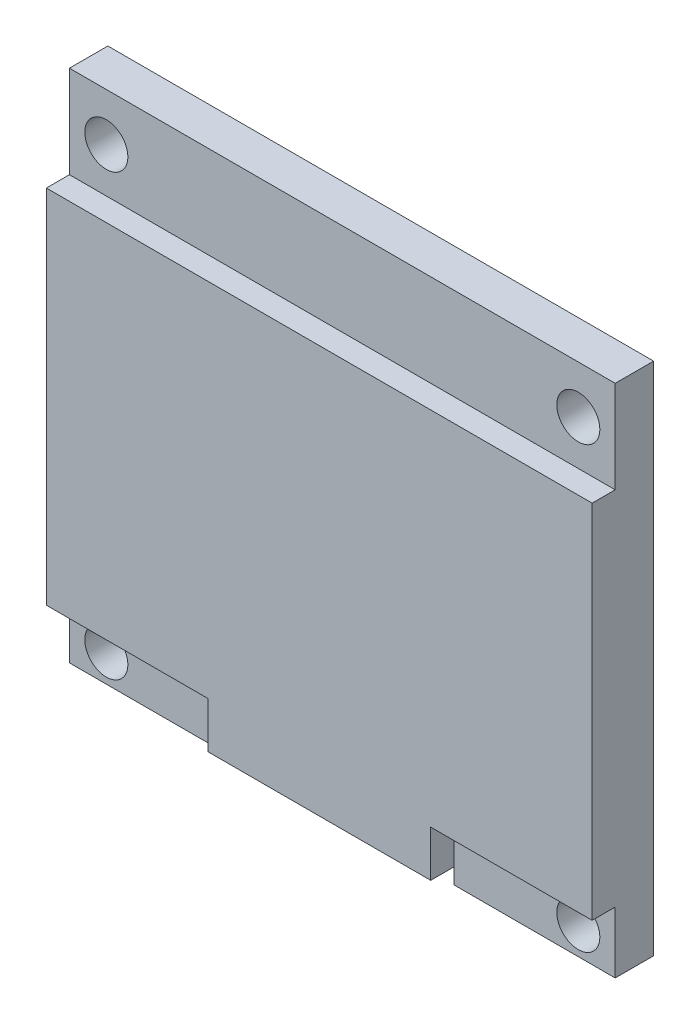
ISO-10303-21;
HEADER;
FILE_DESCRIPTION(('STEP AP214'),'2;1');
FILE_NAME('part.step','',(''),(''),'','','');
FILE_SCHEMA(('AUTOMOTIVE_DESIGN { 1 0 10303 214 1 1 1 1 }'));
ENDSEC;
DATA;
#1=APPLICATION_CONTEXT('core data for automotive mechanical design processes');
#2=APPLICATION_PROTOCOL_DEFINITION('international standard','automotive_design',2000,#1);
#3=PRODUCT_CONTEXT('',#1,'mechanical');
#4=PRODUCT('Part','Part','',(#3));
#5=PRODUCT_RELATED_PRODUCT_CATEGORY('part','',(#4));
#6=PRODUCT_DEFINITION_FORMATION('','',#4);
#7=PRODUCT_DEFINITION_CONTEXT('part definition',#1,'design');
#8=PRODUCT_DEFINITION('design','',#6,#7);
#9=PRODUCT_DEFINITION_SHAPE('','',#8);
#10=(LENGTH_UNIT() NAMED_UNIT(*) SI_UNIT(.MILLI.,.METRE.));
#11=(NAMED_UNIT(*) PLANE_ANGLE_UNIT() SI_UNIT($,.RADIAN.));
#12=(NAMED_UNIT(*) SI_UNIT($,.STERADIAN.) SOLID_ANGLE_UNIT());
#13=UNCERTAINTY_MEASURE_WITH_UNIT(LENGTH_MEASURE(1.E-05),#10,'distance_accuracy_value','');
#14=(GEOMETRIC_REPRESENTATION_CONTEXT(3) GLOBAL_UNCERTAINTY_ASSIGNED_CONTEXT((#13)) GLOBAL_UNIT_ASSIGNED_CONTEXT((#10,
#11,#12)) REPRESENTATION_CONTEXT('',''));
#15=CARTESIAN_POINT('',(0.,0.,0.));
#16=DIRECTION('',(0.,0.,1.));
#17=DIRECTION('',(1.,0.,0.));
#18=AXIS2_PLACEMENT_3D('',#15,#16,#17);
#19=CARTESIAN_POINT('',(-17.75,-16.75,2.5));
#20=DIRECTION('',(0.,1.,0.));
#21=DIRECTION('',(0.,0.,1.));
#22=AXIS2_PLACEMENT_3D('',#19,#20,#21);
#23=PLANE('',#22);
#24=DIRECTION('',(1.,0.,0.));
#25=VECTOR('',#24,1.);
#26=CARTESIAN_POINT('',(-17.75,-16.75,2.5));
#27=LINE('',#26,#25);
#28=CARTESIAN_POINT('',(7.25,-16.75,2.5));
#29=VERTEX_POINT('',#28);
#30=CARTESIAN_POINT('',(17.75,-16.75,2.5));
#31=VERTEX_POINT('',#30);
#32=EDGE_CURVE('E272',#29,#31,#27,.T.);
#33=ORIENTED_EDGE('',*,*,#32,.F.);
#34=DIRECTION('',(0.,0.,1.));
#35=VECTOR('',#34,1.);
#36=CARTESIAN_POINT('',(7.25,-16.75,0.));
#37=LINE('',#36,#35);
#38=CARTESIAN_POINT('',(7.25,-16.75,0.));
#39=VERTEX_POINT('',#38);
#40=EDGE_CURVE('E183',#39,#29,#37,.T.);
#41=ORIENTED_EDGE('',*,*,#40,.F.);
#42=DIRECTION('',(1.,0.,0.));
#43=VECTOR('',#42,1.);
#44=CARTESIAN_POINT('',(-17.75,-16.75,0.));
#45=LINE('',#44,#43);
#46=CARTESIAN_POINT('',(17.75,-16.75,0.));
#47=VERTEX_POINT('',#46);
#48=EDGE_CURVE('E168',#39,#47,#45,.T.);
#49=ORIENTED_EDGE('',*,*,#48,.T.);
#50=DIRECTION('',(0.,0.,-1.));
#51=VECTOR('',#50,1.);
#52=CARTESIAN_POINT('',(17.75,-16.75,2.5));
#53=LINE('',#52,#51);
#54=EDGE_CURVE('E277',#31,#47,#53,.T.);
#55=ORIENTED_EDGE('',*,*,#54,.F.);
#56=EDGE_LOOP('',(#33,#41,#49,#55));
#57=FACE_BOUND('',#56,.T.);
#58=ADVANCED_FACE('F38',(#57),#23,.F.);
#59=CARTESIAN_POINT('',(0.,0.,2.5));
#60=DIRECTION('',(0.,0.,1.));
#61=DIRECTION('',(1.,0.,0.));
#62=AXIS2_PLACEMENT_3D('',#59,#60,#61);
#63=PLANE('',#62);
#64=CARTESIAN_POINT('',(15.35,-14.95,2.5));
#65=DIRECTION('',(0.,0.,1.));
#66=DIRECTION('',(1.,0.,0.));
#67=AXIS2_PLACEMENT_3D('',#64,#65,#66);
#68=CIRCLE('',#67,1.4);
#69=CARTESIAN_POINT('',(16.75,-14.95,2.5));
#70=VERTEX_POINT('',#69);
#71=EDGE_CURVE('E422',#70,#70,#68,.T.);
#72=ORIENTED_EDGE('',*,*,#71,.F.);
#73=EDGE_LOOP('',(#72));
#74=FACE_BOUND('',#73,.T.);
#75=DIRECTION('',(0.,1.,0.));
#76=VECTOR('',#75,1.);
#77=CARTESIAN_POINT('',(7.25,-15.75,2.5));
#78=LINE('',#77,#76);
#79=CARTESIAN_POINT('',(7.25,-15.75,2.5));
#80=VERTEX_POINT('',#79);
#81=EDGE_CURVE('E62',#29,#80,#78,.T.);
#82=ORIENTED_EDGE('',*,*,#81,.F.);
#83=ORIENTED_EDGE('',*,*,#32,.T.);
#84=DIRECTION('',(0.,1.,0.));
#85=VECTOR('',#84,1.);
#86=CARTESIAN_POINT('',(17.75,16.75,2.5));
#87=LINE('',#86,#85);
#88=CARTESIAN_POINT('',(17.75,-12.75,2.5));
#89=VERTEX_POINT('',#88);
#90=EDGE_CURVE('E261',#31,#89,#87,.T.);
#91=ORIENTED_EDGE('',*,*,#90,.T.);
#92=DIRECTION('',(1.,0.,0.));
#93=VECTOR('',#92,1.);
#94=CARTESIAN_POINT('',(0.,-12.75,2.5));
#95=LINE('',#94,#93);
#96=CARTESIAN_POINT('',(7.25,-12.75,2.5));
#97=VERTEX_POINT('',#96);
#98=EDGE_CURVE('E54',#97,#89,#95,.T.);
#99=ORIENTED_EDGE('',*,*,#98,.F.);
#100=DIRECTION('',(0.,-1.,0.));
#101=VECTOR('',#100,1.);
#102=CARTESIAN_POINT('',(7.25,0.,2.5));
#103=LINE('',#102,#101);
#104=EDGE_CURVE('E228',#97,#80,#103,.T.);
#105=ORIENTED_EDGE('',*,*,#104,.T.);
#106=EDGE_LOOP('',(#82,#83,#91,#99,#105));
#107=FACE_BOUND('',#106,.T.);
#108=ADVANCED_FACE('F349',(#74,#107),#63,.T.);
#109=CARTESIAN_POINT('',(15.35,13.65,2.5));
#110=DIRECTION('',(0.,0.,1.));
#111=DIRECTION('',(1.,0.,0.));
#112=AXIS2_PLACEMENT_3D('',#109,#110,#111);
#113=CIRCLE('',#112,1.4);
#114=CARTESIAN_POINT('',(16.75,13.65,2.5));
#115=VERTEX_POINT('',#114);
#116=EDGE_CURVE('E413',#115,#115,#113,.T.);
#117=ORIENTED_EDGE('',*,*,#116,.F.);
#118=EDGE_LOOP('',(#117));
#119=FACE_BOUND('',#118,.T.);
#120=CARTESIAN_POINT('',(-15.35,13.65,2.5));
#121=DIRECTION('',(0.,0.,1.));
#122=DIRECTION('',(-1.,0.,0.));
#123=AXIS2_PLACEMENT_3D('',#120,#121,#122);
#124=CIRCLE('',#123,1.4);
#125=CARTESIAN_POINT('',(-16.75,13.65,2.5));
#126=VERTEX_POINT('',#125);
#127=EDGE_CURVE('E175',#126,#126,#124,.T.);
#128=ORIENTED_EDGE('',*,*,#127,.F.);
#129=EDGE_LOOP('',(#128));
#130=FACE_BOUND('',#129,.T.);
#131=DIRECTION('',(0.,-1.,0.));
#132=VECTOR('',#131,1.);
#133=CARTESIAN_POINT('',(-17.75,16.75,2.5));
#134=LINE('',#133,#132);
#135=CARTESIAN_POINT('',(-17.75,16.75,2.5));
#136=VERTEX_POINT('',#135);
#137=CARTESIAN_POINT('',(-17.75,10.75,2.5));
#138=VERTEX_POINT('',#137);
#139=EDGE_CURVE('E269',#136,#138,#134,.T.);
#140=ORIENTED_EDGE('',*,*,#139,.T.);
#141=DIRECTION('',(1.,0.,0.));
#142=VECTOR('',#141,1.);
#143=CARTESIAN_POINT('',(0.,10.75,2.5));
#144=LINE('',#143,#142);
#145=CARTESIAN_POINT('',(17.75,10.75,2.5));
#146=VERTEX_POINT('',#145);
#147=EDGE_CURVE('E186',#138,#146,#144,.T.);
#148=ORIENTED_EDGE('',*,*,#147,.T.);
#149=CARTESIAN_POINT('',(17.75,16.75,2.5));
#150=VERTEX_POINT('',#149);
#151=EDGE_CURVE('E265',#146,#150,#87,.T.);
#152=ORIENTED_EDGE('',*,*,#151,.T.);
#153=DIRECTION('',(-1.,0.,0.));
#154=VECTOR('',#153,1.);
#155=CARTESIAN_POINT('',(-17.75,16.75,2.5));
#156=LINE('',#155,#154);
#157=EDGE_CURVE('E264',#150,#136,#156,.T.);
#158=ORIENTED_EDGE('',*,*,#157,.T.);
#159=EDGE_LOOP('',(#140,#148,#152,#158));
#160=FACE_BOUND('',#159,.T.);
#161=ADVANCED_FACE('F331',(#119,#130,#160),#63,.T.);
#162=CARTESIAN_POINT('',(17.75,16.75,2.5));
#163=DIRECTION('',(-1.,0.,0.));
#164=DIRECTION('',(0.,-1.,0.));
#165=AXIS2_PLACEMENT_3D('',#162,#163,#164);
#166=PLANE('',#165);
#167=DIRECTION('',(0.,1.,0.));
#168=VECTOR('',#167,1.);
#169=CARTESIAN_POINT('',(17.75,16.75,0.));
#170=LINE('',#169,#168);
#171=CARTESIAN_POINT('',(17.75,16.75,0.));
#172=VERTEX_POINT('',#171);
#173=EDGE_CURVE('E260',#47,#172,#170,.T.);
#174=ORIENTED_EDGE('',*,*,#173,.T.);
#175=DIRECTION('',(0.,0.,-1.));
#176=VECTOR('',#175,1.);
#177=CARTESIAN_POINT('',(17.75,16.75,2.5));
#178=LINE('',#177,#176);
#179=EDGE_CURVE('E11',#150,#172,#178,.T.);
#180=ORIENTED_EDGE('',*,*,#179,.F.);
#181=ORIENTED_EDGE('',*,*,#151,.F.);
#182=DIRECTION('',(0.,0.,-1.));
#183=VECTOR('',#182,1.);
#184=CARTESIAN_POINT('',(17.75,10.75,4.));
#185=LINE('',#184,#183);
#186=CARTESIAN_POINT('',(17.75,10.75,4.));
#187=VERTEX_POINT('',#186);
#188=EDGE_CURVE('E217',#187,#146,#185,.T.);
#189=ORIENTED_EDGE('',*,*,#188,.F.);
#190=DIRECTION('',(0.,1.,0.));
#191=VECTOR('',#190,1.);
#192=CARTESIAN_POINT('',(17.75,0.,4.));
#193=LINE('',#192,#191);
#194=CARTESIAN_POINT('',(17.75,-12.75,4.));
#195=VERTEX_POINT('',#194);
#196=EDGE_CURVE('E214',#195,#187,#193,.T.);
#197=ORIENTED_EDGE('',*,*,#196,.F.);
#198=DIRECTION('',(0.,0.,-1.));
#199=VECTOR('',#198,1.);
#200=CARTESIAN_POINT('',(17.75,-12.75,4.));
#201=LINE('',#200,#199);
#202=EDGE_CURVE('E234',#195,#89,#201,.T.);
#203=ORIENTED_EDGE('',*,*,#202,.T.);
#204=ORIENTED_EDGE('',*,*,#90,.F.);
#205=ORIENTED_EDGE('',*,*,#54,.T.);
#206=EDGE_LOOP('',(#174,#180,#181,#189,#197,#203,#204,#205));
#207=FACE_BOUND('',#206,.T.);
#208=ADVANCED_FACE('F40',(#207),#166,.F.);
#209=CARTESIAN_POINT('',(-17.75,16.75,2.5));
#210=DIRECTION('',(0.,-1.,0.));
#211=DIRECTION('',(0.,0.,-1.));
#212=AXIS2_PLACEMENT_3D('',#209,#210,#211);
#213=PLANE('',#212);
#214=DIRECTION('',(-1.,0.,0.));
#215=VECTOR('',#214,1.);
#216=CARTESIAN_POINT('',(-17.75,16.75,0.));
#217=LINE('',#216,#215);
#218=CARTESIAN_POINT('',(-17.75,16.75,0.));
#219=VERTEX_POINT('',#218);
#220=EDGE_CURVE('E281',#172,#219,#217,.T.);
#221=ORIENTED_EDGE('',*,*,#220,.T.);
#222=DIRECTION('',(0.,0.,-1.));
#223=VECTOR('',#222,1.);
#224=CARTESIAN_POINT('',(-17.75,16.75,2.5));
#225=LINE('',#224,#223);
#226=EDGE_CURVE('E47',#136,#219,#225,.T.);
#227=ORIENTED_EDGE('',*,*,#226,.F.);
#228=ORIENTED_EDGE('',*,*,#157,.F.);
#229=ORIENTED_EDGE('',*,*,#179,.T.);
#230=EDGE_LOOP('',(#221,#227,#228,#229));
#231=FACE_BOUND('',#230,.T.);
#232=ADVANCED_FACE('F372',(#231),#213,.F.);
#233=CARTESIAN_POINT('',(-17.75,16.75,2.5));
#234=DIRECTION('',(1.,0.,0.));
#235=DIRECTION('',(0.,1.,0.));
#236=AXIS2_PLACEMENT_3D('',#233,#234,#235);
#237=PLANE('',#236);
#238=DIRECTION('',(0.,-1.,0.));
#239=VECTOR('',#238,1.);
#240=CARTESIAN_POINT('',(-17.75,16.75,0.));
#241=LINE('',#240,#239);
#242=CARTESIAN_POINT('',(-17.75,-16.75,0.));
#243=VERTEX_POINT('',#242);
#244=EDGE_CURVE('E284',#219,#243,#241,.T.);
#245=ORIENTED_EDGE('',*,*,#244,.T.);
#246=DIRECTION('',(0.,0.,-1.));
#247=VECTOR('',#246,1.);
#248=CARTESIAN_POINT('',(-17.75,-16.75,2.5));
#249=LINE('',#248,#247);
#250=CARTESIAN_POINT('',(-17.75,-16.75,2.5));
#251=VERTEX_POINT('',#250);
#252=EDGE_CURVE('E294',#251,#243,#249,.T.);
#253=ORIENTED_EDGE('',*,*,#252,.F.);
#254=CARTESIAN_POINT('',(-17.75,-12.75,2.5));
#255=VERTEX_POINT('',#254);
#256=EDGE_CURVE('E268',#255,#251,#134,.T.);
#257=ORIENTED_EDGE('',*,*,#256,.F.);
#258=DIRECTION('',(0.,0.,-1.));
#259=VECTOR('',#258,1.);
#260=CARTESIAN_POINT('',(-17.75,-12.75,4.));
#261=LINE('',#260,#259);
#262=CARTESIAN_POINT('',(-17.75,-12.75,4.));
#263=VERTEX_POINT('',#262);
#264=EDGE_CURVE('E252',#263,#255,#261,.T.);
#265=ORIENTED_EDGE('',*,*,#264,.F.);
#266=DIRECTION('',(0.,-1.,0.));
#267=VECTOR('',#266,1.);
#268=CARTESIAN_POINT('',(-17.75,0.,4.));
#269=LINE('',#268,#267);
#270=CARTESIAN_POINT('',(-17.75,10.75,4.));
#271=VERTEX_POINT('',#270);
#272=EDGE_CURVE('E197',#271,#263,#269,.T.);
#273=ORIENTED_EDGE('',*,*,#272,.F.);
#274=DIRECTION('',(0.,0.,-1.));
#275=VECTOR('',#274,1.);
#276=CARTESIAN_POINT('',(-17.75,10.75,4.));
#277=LINE('',#276,#275);
#278=EDGE_CURVE('E256',#271,#138,#277,.T.);
#279=ORIENTED_EDGE('',*,*,#278,.T.);
#280=ORIENTED_EDGE('',*,*,#139,.F.);
#281=ORIENTED_EDGE('',*,*,#226,.T.);
#282=EDGE_LOOP('',(#245,#253,#257,#265,#273,#279,#280,#281));
#283=FACE_BOUND('',#282,.T.);
#284=ADVANCED_FACE('F303',(#283),#237,.F.);
#285=CARTESIAN_POINT('',(-7.25000000000001,-16.75,0.));
#286=VERTEX_POINT('',#285);
#287=EDGE_CURVE('E287',#243,#286,#45,.T.);
#288=ORIENTED_EDGE('',*,*,#287,.T.);
#289=DIRECTION('',(0.,0.,1.));
#290=VECTOR('',#289,1.);
#291=CARTESIAN_POINT('',(-7.25000000000001,-16.75,0.));
#292=LINE('',#291,#290);
#293=CARTESIAN_POINT('',(-7.25000000000001,-16.75,2.5));
#294=VERTEX_POINT('',#293);
#295=EDGE_CURVE('E187',#286,#294,#292,.T.);
#296=ORIENTED_EDGE('',*,*,#295,.T.);
#297=EDGE_CURVE('E273',#251,#294,#27,.T.);
#298=ORIENTED_EDGE('',*,*,#297,.F.);
#299=ORIENTED_EDGE('',*,*,#252,.T.);
#300=EDGE_LOOP('',(#288,#296,#298,#299));
#301=FACE_BOUND('',#300,.T.);
#302=ADVANCED_FACE('F309',(#301),#23,.F.);
#303=CARTESIAN_POINT('',(-15.35,-14.95,2.5));
#304=DIRECTION('',(0.,0.,-1.));
#305=DIRECTION('',(-1.,0.,0.));
#306=AXIS2_PLACEMENT_3D('',#303,#304,#305);
#307=CIRCLE('',#306,1.4);
#308=CARTESIAN_POINT('',(-16.75,-14.95,2.5));
#309=VERTEX_POINT('',#308);
#310=EDGE_CURVE('E428',#309,#309,#307,.T.);
#311=ORIENTED_EDGE('',*,*,#310,.T.);
#312=EDGE_LOOP('',(#311));
#313=FACE_BOUND('',#312,.T.);
#314=DIRECTION('',(0.,-1.,0.));
#315=VECTOR('',#314,1.);
#316=CARTESIAN_POINT('',(-7.25000000000001,-15.75,2.5));
#317=LINE('',#316,#315);
#318=CARTESIAN_POINT('',(-7.25000000000001,-15.75,2.5));
#319=VERTEX_POINT('',#318);
#320=EDGE_CURVE('E170',#319,#294,#317,.T.);
#321=ORIENTED_EDGE('',*,*,#320,.F.);
#322=DIRECTION('',(0.,-1.,0.));
#323=VECTOR('',#322,1.);
#324=CARTESIAN_POINT('',(-7.25000000000001,0.,2.5));
#325=LINE('',#324,#323);
#326=CARTESIAN_POINT('',(-7.25000000000001,-12.75,2.5));
#327=VERTEX_POINT('',#326);
#328=EDGE_CURVE('E224',#327,#319,#325,.T.);
#329=ORIENTED_EDGE('',*,*,#328,.F.);
#330=EDGE_CURVE('E220',#255,#327,#95,.T.);
#331=ORIENTED_EDGE('',*,*,#330,.F.);
#332=ORIENTED_EDGE('',*,*,#256,.T.);
#333=ORIENTED_EDGE('',*,*,#297,.T.);
#334=EDGE_LOOP('',(#321,#329,#331,#332,#333));
#335=FACE_BOUND('',#334,.T.);
#336=ADVANCED_FACE('F363',(#313,#335),#63,.T.);
#337=CARTESIAN_POINT('',(0.,0.,0.));
#338=DIRECTION('',(0.,0.,1.));
#339=DIRECTION('',(1.,0.,0.));
#340=AXIS2_PLACEMENT_3D('',#337,#338,#339);
#341=PLANE('',#340);
#342=CARTESIAN_POINT('',(-15.35,-14.95,0.));
#343=DIRECTION('',(0.,0.,-1.));
#344=DIRECTION('',(-1.,0.,0.));
#345=AXIS2_PLACEMENT_3D('',#342,#343,#344);
#346=CIRCLE('',#345,1.4);
#347=CARTESIAN_POINT('',(-16.75,-14.95,0.));
#348=VERTEX_POINT('',#347);
#349=EDGE_CURVE('E400',#348,#348,#346,.T.);
#350=ORIENTED_EDGE('',*,*,#349,.F.);
#351=EDGE_LOOP('',(#350));
#352=FACE_BOUND('',#351,.T.);
#353=CARTESIAN_POINT('',(15.35,-14.95,0.));
#354=DIRECTION('',(0.,0.,1.));
#355=DIRECTION('',(1.,0.,0.));
#356=AXIS2_PLACEMENT_3D('',#353,#354,#355);
#357=CIRCLE('',#356,1.4);
#358=CARTESIAN_POINT('',(16.75,-14.95,0.));
#359=VERTEX_POINT('',#358);
#360=EDGE_CURVE('E404',#359,#359,#357,.T.);
#361=ORIENTED_EDGE('',*,*,#360,.T.);
#362=EDGE_LOOP('',(#361));
#363=FACE_BOUND('',#362,.T.);
#364=CARTESIAN_POINT('',(15.35,13.65,0.));
#365=DIRECTION('',(0.,0.,1.));
#366=DIRECTION('',(1.,0.,0.));
#367=AXIS2_PLACEMENT_3D('',#364,#365,#366);
#368=CIRCLE('',#367,1.4);
#369=CARTESIAN_POINT('',(16.75,13.65,0.));
#370=VERTEX_POINT('',#369);
#371=EDGE_CURVE('E181',#370,#370,#368,.T.);
#372=ORIENTED_EDGE('',*,*,#371,.T.);
#373=EDGE_LOOP('',(#372));
#374=FACE_BOUND('',#373,.T.);
#375=CARTESIAN_POINT('',(-15.35,13.65,0.));
#376=DIRECTION('',(0.,0.,1.));
#377=DIRECTION('',(-1.,0.,0.));
#378=AXIS2_PLACEMENT_3D('',#375,#376,#377);
#379=CIRCLE('',#378,1.4);
#380=CARTESIAN_POINT('',(-16.75,13.65,0.));
#381=VERTEX_POINT('',#380);
#382=EDGE_CURVE('E410',#381,#381,#379,.T.);
#383=ORIENTED_EDGE('',*,*,#382,.T.);
#384=EDGE_LOOP('',(#383));
#385=FACE_BOUND('',#384,.T.);
#386=ORIENTED_EDGE('',*,*,#48,.F.);
#387=DIRECTION('',(0.,1.,0.));
#388=VECTOR('',#387,1.);
#389=CARTESIAN_POINT('',(7.25,-15.75,0.));
#390=LINE('',#389,#388);
#391=CARTESIAN_POINT('',(7.25,-15.75,0.));
#392=VERTEX_POINT('',#391);
#393=EDGE_CURVE('E148',#39,#392,#390,.T.);
#394=ORIENTED_EDGE('',*,*,#393,.T.);
#395=DIRECTION('',(-1.,0.,0.));
#396=VECTOR('',#395,1.);
#397=CARTESIAN_POINT('',(-7.25000000000001,-15.75,0.));
#398=LINE('',#397,#396);
#399=CARTESIAN_POINT('',(-7.25000000000001,-15.75,0.));
#400=VERTEX_POINT('',#399);
#401=EDGE_CURVE('E157',#392,#400,#398,.T.);
#402=ORIENTED_EDGE('',*,*,#401,.T.);
#403=DIRECTION('',(0.,-1.,0.));
#404=VECTOR('',#403,1.);
#405=CARTESIAN_POINT('',(-7.25000000000001,-15.75,0.));
#406=LINE('',#405,#404);
#407=EDGE_CURVE('E154',#400,#286,#406,.T.);
#408=ORIENTED_EDGE('',*,*,#407,.T.);
#409=ORIENTED_EDGE('',*,*,#287,.F.);
#410=ORIENTED_EDGE('',*,*,#244,.F.);
#411=ORIENTED_EDGE('',*,*,#220,.F.);
#412=ORIENTED_EDGE('',*,*,#173,.F.);
#413=EDGE_LOOP('',(#386,#394,#402,#408,#409,#410,#411,#412));
#414=FACE_BOUND('',#413,.T.);
#415=ADVANCED_FACE('F166',(#352,#363,#374,#385,#414),#341,.F.);
#416=CARTESIAN_POINT('',(0.,10.75,4.));
#417=DIRECTION('',(0.,1.,0.));
#418=DIRECTION('',(0.,0.,1.));
#419=AXIS2_PLACEMENT_3D('',#416,#417,#418);
#420=PLANE('',#419);
#421=ORIENTED_EDGE('',*,*,#147,.F.);
#422=ORIENTED_EDGE('',*,*,#278,.F.);
#423=DIRECTION('',(1.,0.,0.));
#424=VECTOR('',#423,1.);
#425=CARTESIAN_POINT('',(0.,10.75,4.));
#426=LINE('',#425,#424);
#427=EDGE_CURVE('E193',#271,#187,#426,.T.);
#428=ORIENTED_EDGE('',*,*,#427,.T.);
#429=ORIENTED_EDGE('',*,*,#188,.T.);
#430=EDGE_LOOP('',(#421,#422,#428,#429));
#431=FACE_BOUND('',#430,.T.);
#432=ADVANCED_FACE('F327',(#431),#420,.T.);
#433=CARTESIAN_POINT('',(0.,-12.75,4.));
#434=DIRECTION('',(0.,1.,0.));
#435=DIRECTION('',(0.,0.,1.));
#436=AXIS2_PLACEMENT_3D('',#433,#434,#435);
#437=PLANE('',#436);
#438=ORIENTED_EDGE('',*,*,#330,.T.);
#439=DIRECTION('',(0.,0.,-1.));
#440=VECTOR('',#439,1.);
#441=CARTESIAN_POINT('',(-7.25000000000001,-12.75,4.));
#442=LINE('',#441,#440);
#443=CARTESIAN_POINT('',(-7.25000000000001,-12.75,4.));
#444=VERTEX_POINT('',#443);
#445=EDGE_CURVE('E248',#444,#327,#442,.T.);
#446=ORIENTED_EDGE('',*,*,#445,.F.);
#447=DIRECTION('',(1.,0.,0.));
#448=VECTOR('',#447,1.);
#449=CARTESIAN_POINT('',(0.,-12.75,4.));
#450=LINE('',#449,#448);
#451=EDGE_CURVE('E200',#263,#444,#450,.T.);
#452=ORIENTED_EDGE('',*,*,#451,.F.);
#453=ORIENTED_EDGE('',*,*,#264,.T.);
#454=EDGE_LOOP('',(#438,#446,#452,#453));
#455=FACE_BOUND('',#454,.T.);
#456=ADVANCED_FACE('F318',(#455),#437,.F.);
#457=CARTESIAN_POINT('',(-7.25000000000001,0.,4.));
#458=DIRECTION('',(1.,0.,0.));
#459=DIRECTION('',(0.,0.,-1.));
#460=AXIS2_PLACEMENT_3D('',#457,#458,#459);
#461=PLANE('',#460);
#462=ORIENTED_EDGE('',*,*,#328,.T.);
#463=DIRECTION('',(0.,0.,-1.));
#464=VECTOR('',#463,1.);
#465=CARTESIAN_POINT('',(-7.25000000000001,-15.75,4.));
#466=LINE('',#465,#464);
#467=CARTESIAN_POINT('',(-7.25000000000001,-15.75,4.));
#468=VERTEX_POINT('',#467);
#469=EDGE_CURVE('E245',#468,#319,#466,.T.);
#470=ORIENTED_EDGE('',*,*,#469,.F.);
#471=DIRECTION('',(0.,-1.,0.));
#472=VECTOR('',#471,1.);
#473=CARTESIAN_POINT('',(-7.25000000000001,0.,4.));
#474=LINE('',#473,#472);
#475=EDGE_CURVE('E203',#444,#468,#474,.T.);
#476=ORIENTED_EDGE('',*,*,#475,.F.);
#477=ORIENTED_EDGE('',*,*,#445,.T.);
#478=EDGE_LOOP('',(#462,#470,#476,#477));
#479=FACE_BOUND('',#478,.T.);
#480=ADVANCED_FACE('F443',(#479),#461,.F.);
#481=CARTESIAN_POINT('',(0.,-15.75,4.));
#482=DIRECTION('',(0.,1.,0.));
#483=DIRECTION('',(0.,0.,1.));
#484=AXIS2_PLACEMENT_3D('',#481,#482,#483);
#485=PLANE('',#484);
#486=ORIENTED_EDGE('',*,*,#469,.T.);
#487=DIRECTION('',(0.,0.,1.));
#488=VECTOR('',#487,1.);
#489=CARTESIAN_POINT('',(-7.25000000000001,-15.75,0.));
#490=LINE('',#489,#488);
#491=EDGE_CURVE('E153',#400,#319,#490,.T.);
#492=ORIENTED_EDGE('',*,*,#491,.F.);
#493=ORIENTED_EDGE('',*,*,#401,.F.);
#494=DIRECTION('',(0.,0.,1.));
#495=VECTOR('',#494,1.);
#496=CARTESIAN_POINT('',(7.25,-15.75,0.));
#497=LINE('',#496,#495);
#498=EDGE_CURVE('E144',#392,#80,#497,.T.);
#499=ORIENTED_EDGE('',*,*,#498,.T.);
#500=DIRECTION('',(0.,0.,-1.));
#501=VECTOR('',#500,1.);
#502=CARTESIAN_POINT('',(7.25,-15.75,4.));
#503=LINE('',#502,#501);
#504=CARTESIAN_POINT('',(7.25,-15.75,4.));
#505=VERTEX_POINT('',#504);
#506=EDGE_CURVE('E241',#505,#80,#503,.T.);
#507=ORIENTED_EDGE('',*,*,#506,.F.);
#508=DIRECTION('',(1.,0.,0.));
#509=VECTOR('',#508,1.);
#510=CARTESIAN_POINT('',(0.,-15.75,4.));
#511=LINE('',#510,#509);
#512=EDGE_CURVE('E207',#468,#505,#511,.T.);
#513=ORIENTED_EDGE('',*,*,#512,.F.);
#514=EDGE_LOOP('',(#486,#492,#493,#499,#507,#513));
#515=FACE_BOUND('',#514,.T.);
#516=ADVANCED_FACE('F159',(#515),#485,.F.);
#517=CARTESIAN_POINT('',(7.25,0.,4.));
#518=DIRECTION('',(1.,0.,0.));
#519=DIRECTION('',(0.,0.,-1.));
#520=AXIS2_PLACEMENT_3D('',#517,#518,#519);
#521=PLANE('',#520);
#522=ORIENTED_EDGE('',*,*,#104,.F.);
#523=DIRECTION('',(0.,0.,-1.));
#524=VECTOR('',#523,1.);
#525=CARTESIAN_POINT('',(7.25,-12.75,4.));
#526=LINE('',#525,#524);
#527=CARTESIAN_POINT('',(7.25,-12.75,4.));
#528=VERTEX_POINT('',#527);
#529=EDGE_CURVE('E238',#528,#97,#526,.T.);
#530=ORIENTED_EDGE('',*,*,#529,.F.);
#531=DIRECTION('',(0.,-1.,0.));
#532=VECTOR('',#531,1.);
#533=CARTESIAN_POINT('',(7.25,0.,4.));
#534=LINE('',#533,#532);
#535=EDGE_CURVE('E210',#528,#505,#534,.T.);
#536=ORIENTED_EDGE('',*,*,#535,.T.);
#537=ORIENTED_EDGE('',*,*,#506,.T.);
#538=EDGE_LOOP('',(#522,#530,#536,#537));
#539=FACE_BOUND('',#538,.T.);
#540=ADVANCED_FACE('F348',(#539),#521,.T.);
#541=ORIENTED_EDGE('',*,*,#98,.T.);
#542=ORIENTED_EDGE('',*,*,#202,.F.);
#543=EDGE_CURVE('E204',#528,#195,#450,.T.);
#544=ORIENTED_EDGE('',*,*,#543,.F.);
#545=ORIENTED_EDGE('',*,*,#529,.T.);
#546=EDGE_LOOP('',(#541,#542,#544,#545));
#547=FACE_BOUND('',#546,.T.);
#548=ADVANCED_FACE('F341',(#547),#437,.F.);
#549=CARTESIAN_POINT('',(0.,0.,4.));
#550=DIRECTION('',(0.,0.,1.));
#551=DIRECTION('',(1.,0.,0.));
#552=AXIS2_PLACEMENT_3D('',#549,#550,#551);
#553=PLANE('',#552);
#554=ORIENTED_EDGE('',*,*,#427,.F.);
#555=ORIENTED_EDGE('',*,*,#272,.T.);
#556=ORIENTED_EDGE('',*,*,#451,.T.);
#557=ORIENTED_EDGE('',*,*,#475,.T.);
#558=ORIENTED_EDGE('',*,*,#512,.T.);
#559=ORIENTED_EDGE('',*,*,#535,.F.);
#560=ORIENTED_EDGE('',*,*,#543,.T.);
#561=ORIENTED_EDGE('',*,*,#196,.T.);
#562=EDGE_LOOP('',(#554,#555,#556,#557,#558,#559,#560,#561));
#563=FACE_BOUND('',#562,.T.);
#564=ADVANCED_FACE('F323',(#563),#553,.T.);
#565=CARTESIAN_POINT('',(7.25,-15.75,0.));
#566=DIRECTION('',(1.,0.,0.));
#567=DIRECTION('',(0.,1.,0.));
#568=AXIS2_PLACEMENT_3D('',#565,#566,#567);
#569=PLANE('',#568);
#570=ORIENTED_EDGE('',*,*,#81,.T.);
#571=ORIENTED_EDGE('',*,*,#498,.F.);
#572=ORIENTED_EDGE('',*,*,#393,.F.);
#573=ORIENTED_EDGE('',*,*,#40,.T.);
#574=EDGE_LOOP('',(#570,#571,#572,#573));
#575=FACE_BOUND('',#574,.T.);
#576=ADVANCED_FACE('F146',(#575),#569,.F.);
#577=CARTESIAN_POINT('',(-7.25000000000001,-15.75,0.));
#578=DIRECTION('',(-1.,0.,0.));
#579=DIRECTION('',(0.,0.,1.));
#580=AXIS2_PLACEMENT_3D('',#577,#578,#579);
#581=PLANE('',#580);
#582=ORIENTED_EDGE('',*,*,#320,.T.);
#583=ORIENTED_EDGE('',*,*,#295,.F.);
#584=ORIENTED_EDGE('',*,*,#407,.F.);
#585=ORIENTED_EDGE('',*,*,#491,.T.);
#586=EDGE_LOOP('',(#582,#583,#584,#585));
#587=FACE_BOUND('',#586,.T.);
#588=ADVANCED_FACE('F459',(#587),#581,.F.);
#589=CARTESIAN_POINT('',(-15.35,13.65,0.));
#590=DIRECTION('',(0.,0.,1.));
#591=DIRECTION('',(1.,0.,0.));
#592=AXIS2_PLACEMENT_3D('',#589,#590,#591);
#593=CYLINDRICAL_SURFACE('',#592,1.4);
#594=ORIENTED_EDGE('',*,*,#382,.F.);
#595=EDGE_LOOP('',(#594));
#596=FACE_BOUND('',#595,.T.);
#597=ORIENTED_EDGE('',*,*,#127,.T.);
#598=EDGE_LOOP('',(#597));
#599=FACE_BOUND('',#598,.T.);
#600=ADVANCED_FACE('F462',(#596,#599),#593,.F.);
#601=CARTESIAN_POINT('',(15.35,13.65,0.));
#602=DIRECTION('',(0.,0.,1.));
#603=DIRECTION('',(1.,0.,0.));
#604=AXIS2_PLACEMENT_3D('',#601,#602,#603);
#605=CYLINDRICAL_SURFACE('',#604,1.4);
#606=ORIENTED_EDGE('',*,*,#371,.F.);
#607=EDGE_LOOP('',(#606));
#608=FACE_BOUND('',#607,.T.);
#609=ORIENTED_EDGE('',*,*,#116,.T.);
#610=EDGE_LOOP('',(#609));
#611=FACE_BOUND('',#610,.T.);
#612=ADVANCED_FACE('F465',(#608,#611),#605,.F.);
#613=CARTESIAN_POINT('',(15.35,-14.95,0.));
#614=DIRECTION('',(0.,0.,1.));
#615=DIRECTION('',(1.,0.,0.));
#616=AXIS2_PLACEMENT_3D('',#613,#614,#615);
#617=CYLINDRICAL_SURFACE('',#616,1.4);
#618=ORIENTED_EDGE('',*,*,#360,.F.);
#619=EDGE_LOOP('',(#618));
#620=FACE_BOUND('',#619,.T.);
#621=ORIENTED_EDGE('',*,*,#71,.T.);
#622=EDGE_LOOP('',(#621));
#623=FACE_BOUND('',#622,.T.);
#624=ADVANCED_FACE('F437',(#620,#623),#617,.F.);
#625=CARTESIAN_POINT('',(-15.35,-14.95,0.));
#626=DIRECTION('',(0.,0.,1.));
#627=DIRECTION('',(1.,0.,0.));
#628=AXIS2_PLACEMENT_3D('',#625,#626,#627);
#629=CYLINDRICAL_SURFACE('',#628,1.4);
#630=ORIENTED_EDGE('',*,*,#349,.T.);
#631=EDGE_LOOP('',(#630));
#632=FACE_BOUND('',#631,.T.);
#633=ORIENTED_EDGE('',*,*,#310,.F.);
#634=EDGE_LOOP('',(#633));
#635=FACE_BOUND('',#634,.T.);
#636=ADVANCED_FACE('F434',(#632,#635),#629,.F.);
#637=CLOSED_SHELL('',(#58,#108,#161,#208,#232,#284,#302,#336,#415,#432,#456,#480,#516,#540,#548,
#564,#576,#588,#600,#612,#624,#636));
#638=MANIFOLD_SOLID_BREP('B2',#637);
#639=ADVANCED_BREP_SHAPE_REPRESENTATION('',(#18,#638),#14);
#640=SHAPE_DEFINITION_REPRESENTATION(#9,#639);
ENDSEC;
END-ISO-10303-21;
